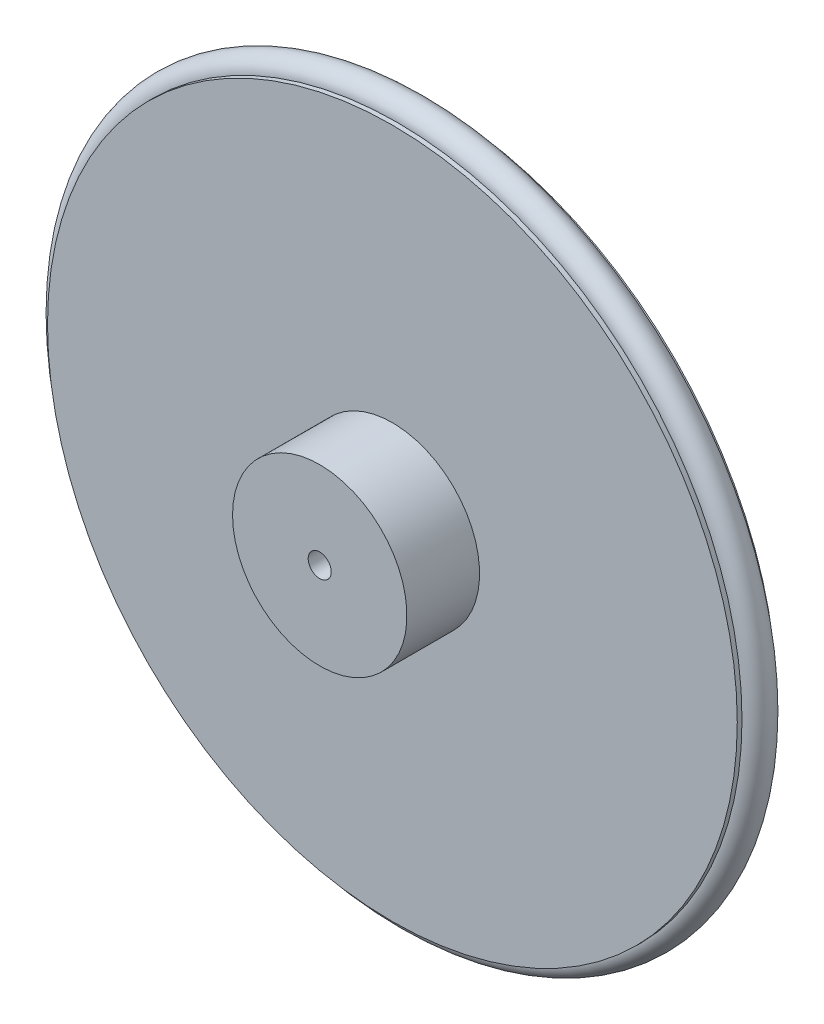
ISO-10303-21;
HEADER;
FILE_DESCRIPTION(('STEP AP214'),'2;1');
FILE_NAME('part.step','',(''),(''),'','','');
FILE_SCHEMA(('AUTOMOTIVE_DESIGN { 1 0 10303 214 1 1 1 1 }'));
ENDSEC;
DATA;
#1=APPLICATION_CONTEXT('core data for automotive mechanical design processes');
#2=APPLICATION_PROTOCOL_DEFINITION('international standard','automotive_design',2000,#1);
#3=PRODUCT_CONTEXT('',#1,'mechanical');
#4=PRODUCT('Part','Part','',(#3));
#5=PRODUCT_RELATED_PRODUCT_CATEGORY('part','',(#4));
#6=PRODUCT_DEFINITION_FORMATION('','',#4);
#7=PRODUCT_DEFINITION_CONTEXT('part definition',#1,'design');
#8=PRODUCT_DEFINITION('design','',#6,#7);
#9=PRODUCT_DEFINITION_SHAPE('','',#8);
#10=(LENGTH_UNIT() NAMED_UNIT(*) SI_UNIT(.MILLI.,.METRE.));
#11=(NAMED_UNIT(*) PLANE_ANGLE_UNIT() SI_UNIT($,.RADIAN.));
#12=(NAMED_UNIT(*) SI_UNIT($,.STERADIAN.) SOLID_ANGLE_UNIT());
#13=UNCERTAINTY_MEASURE_WITH_UNIT(LENGTH_MEASURE(1.E-05),#10,'distance_accuracy_value','');
#14=(GEOMETRIC_REPRESENTATION_CONTEXT(3) GLOBAL_UNCERTAINTY_ASSIGNED_CONTEXT((#13)) GLOBAL_UNIT_ASSIGNED_CONTEXT((#10,
#11,#12)) REPRESENTATION_CONTEXT('',''));
#15=CARTESIAN_POINT('',(0.,0.,0.));
#16=DIRECTION('',(0.,0.,1.));
#17=DIRECTION('',(1.,0.,0.));
#18=AXIS2_PLACEMENT_3D('',#15,#16,#17);
#19=CARTESIAN_POINT('',(7.55868520061591,0.,-14.3137465219913));
#20=DIRECTION('',(0.,0.,-1.));
#21=DIRECTION('',(-1.,0.,0.));
#22=AXIS2_PLACEMENT_3D('',#19,#20,#21);
#23=PLANE('',#22);
#24=CARTESIAN_POINT('',(0.,0.,-14.3137465219913));
#25=DIRECTION('',(0.,0.,-1.));
#26=DIRECTION('',(-1.,0.,0.));
#27=AXIS2_PLACEMENT_3D('',#24,#25,#26);
#28=CIRCLE('',#27,29.9);
#29=CARTESIAN_POINT('',(-29.9,0.,-14.3137465219913));
#30=VERTEX_POINT('',#29);
#31=EDGE_CURVE('E10',#30,#30,#28,.T.);
#32=ORIENTED_EDGE('',*,*,#31,.F.);
#33=EDGE_LOOP('',(#32));
#34=FACE_BOUND('',#33,.T.);
#35=CARTESIAN_POINT('',(0.,0.,-14.3137465219913));
#36=DIRECTION('',(0.,0.,-1.));
#37=DIRECTION('',(-1.,0.,0.));
#38=AXIS2_PLACEMENT_3D('',#35,#36,#37);
#39=CIRCLE('',#38,7.55868520061591);
#40=CARTESIAN_POINT('',(-7.55868520061591,0.,-14.3137465219913));
#41=VERTEX_POINT('',#40);
#42=EDGE_CURVE('E62',#41,#41,#39,.T.);
#43=ORIENTED_EDGE('',*,*,#42,.T.);
#44=EDGE_LOOP('',(#43));
#45=FACE_BOUND('',#44,.T.);
#46=ADVANCED_FACE('F34',(#34,#45),#23,.F.);
#47=CARTESIAN_POINT('',(0.,0.,-20.0286107365983));
#48=DIRECTION('',(0.,0.,-1.));
#49=DIRECTION('',(-1.,0.,0.));
#50=AXIS2_PLACEMENT_3D('',#47,#48,#49);
#51=CYLINDRICAL_SURFACE('',#50,29.9);
#52=CARTESIAN_POINT('',(0.,0.,-14.7237465219913));
#53=DIRECTION('',(0.,0.,-1.));
#54=DIRECTION('',(-1.,0.,0.));
#55=AXIS2_PLACEMENT_3D('',#52,#53,#54);
#56=CIRCLE('',#55,29.9);
#57=CARTESIAN_POINT('',(-29.9,0.,-14.7237465219913));
#58=VERTEX_POINT('',#57);
#59=EDGE_CURVE('E40',#58,#58,#56,.T.);
#60=ORIENTED_EDGE('',*,*,#59,.F.);
#61=EDGE_LOOP('',(#60));
#62=FACE_BOUND('',#61,.T.);
#63=ORIENTED_EDGE('',*,*,#31,.T.);
#64=EDGE_LOOP('',(#63));
#65=FACE_BOUND('',#64,.T.);
#66=ADVANCED_FACE('F96',(#62,#65),#51,.T.);
#67=CARTESIAN_POINT('',(0.,0.,-16.0137465219913));
#68=DIRECTION('',(0.,0.,-1.));
#69=DIRECTION('',(-1.,0.,0.));
#70=AXIS2_PLACEMENT_3D('',#67,#68,#69);
#71=TOROIDAL_SURFACE('',#70,29.9,1.29);
#72=CARTESIAN_POINT('',(0.,0.,-17.3037465219913));
#73=DIRECTION('',(0.,0.,-1.));
#74=DIRECTION('',(-1.,0.,0.));
#75=AXIS2_PLACEMENT_3D('',#72,#73,#74);
#76=CIRCLE('',#75,29.9);
#77=CARTESIAN_POINT('',(-29.9,0.,-17.3037465219913));
#78=VERTEX_POINT('',#77);
#79=EDGE_CURVE('E44',#78,#78,#76,.T.);
#80=ORIENTED_EDGE('',*,*,#79,.F.);
#81=EDGE_LOOP('',(#80));
#82=FACE_BOUND('',#81,.T.);
#83=ORIENTED_EDGE('',*,*,#59,.T.);
#84=EDGE_LOOP('',(#83));
#85=FACE_BOUND('',#84,.T.);
#86=ADVANCED_FACE('F101',(#82,#85),#71,.T.);
#87=CARTESIAN_POINT('',(0.,0.,-20.0286107365983));
#88=DIRECTION('',(0.,0.,-1.));
#89=DIRECTION('',(-1.,0.,0.));
#90=AXIS2_PLACEMENT_3D('',#87,#88,#89);
#91=CYLINDRICAL_SURFACE('',#90,29.9);
#92=CARTESIAN_POINT('',(0.,0.,-17.7137465219913));
#93=DIRECTION('',(0.,0.,-1.));
#94=DIRECTION('',(-1.,0.,0.));
#95=AXIS2_PLACEMENT_3D('',#92,#93,#94);
#96=CIRCLE('',#95,29.9);
#97=CARTESIAN_POINT('',(-29.9,0.,-17.7137465219913));
#98=VERTEX_POINT('',#97);
#99=EDGE_CURVE('E48',#98,#98,#96,.T.);
#100=ORIENTED_EDGE('',*,*,#99,.F.);
#101=EDGE_LOOP('',(#100));
#102=FACE_BOUND('',#101,.T.);
#103=ORIENTED_EDGE('',*,*,#79,.T.);
#104=EDGE_LOOP('',(#103));
#105=FACE_BOUND('',#104,.T.);
#106=ADVANCED_FACE('F92',(#102,#105),#91,.T.);
#107=CARTESIAN_POINT('',(0.,0.,-17.7137465219913));
#108=DIRECTION('',(0.,0.,1.));
#109=DIRECTION('',(1.,0.,0.));
#110=AXIS2_PLACEMENT_3D('',#107,#108,#109);
#111=PLANE('',#110);
#112=ORIENTED_EDGE('',*,*,#99,.T.);
#113=EDGE_LOOP('',(#112));
#114=FACE_BOUND('',#113,.T.);
#115=ADVANCED_FACE('F87',(#114),#111,.F.);
#116=CARTESIAN_POINT('',(0.,0.,-17.0528960281312));
#117=DIRECTION('',(0.,0.,-1.));
#118=DIRECTION('',(-1.,0.,0.));
#119=AXIS2_PLACEMENT_3D('',#116,#117,#118);
#120=PLANE('',#119);
#121=CARTESIAN_POINT('',(0.,0.,-17.0528960281312));
#122=DIRECTION('',(0.,0.,-1.));
#123=DIRECTION('',(-1.,0.,0.));
#124=AXIS2_PLACEMENT_3D('',#121,#122,#123);
#125=CIRCLE('',#124,1.);
#126=CARTESIAN_POINT('',(-1.,0.,-17.0528960281312));
#127=VERTEX_POINT('',#126);
#128=EDGE_CURVE('E53',#127,#127,#125,.T.);
#129=ORIENTED_EDGE('',*,*,#128,.F.);
#130=EDGE_LOOP('',(#129));
#131=FACE_BOUND('',#130,.T.);
#132=ADVANCED_FACE('F82',(#131),#120,.F.);
#133=CARTESIAN_POINT('',(0.,0.,-20.0286107365983));
#134=DIRECTION('',(0.,0.,-1.));
#135=DIRECTION('',(-1.,0.,0.));
#136=AXIS2_PLACEMENT_3D('',#133,#134,#135);
#137=CYLINDRICAL_SURFACE('',#136,1.);
#138=CARTESIAN_POINT('',(0.,0.,-8.01374652199125));
#139=DIRECTION('',(0.,0.,-1.));
#140=DIRECTION('',(-1.,0.,0.));
#141=AXIS2_PLACEMENT_3D('',#138,#139,#140);
#142=CIRCLE('',#141,1.);
#143=CARTESIAN_POINT('',(-1.,0.,-8.01374652199125));
#144=VERTEX_POINT('',#143);
#145=EDGE_CURVE('E56',#144,#144,#142,.T.);
#146=ORIENTED_EDGE('',*,*,#145,.F.);
#147=EDGE_LOOP('',(#146));
#148=FACE_BOUND('',#147,.T.);
#149=ORIENTED_EDGE('',*,*,#128,.T.);
#150=EDGE_LOOP('',(#149));
#151=FACE_BOUND('',#150,.T.);
#152=ADVANCED_FACE('F76',(#148,#151),#137,.F.);
#153=CARTESIAN_POINT('',(1.,0.,-8.01374652199125));
#154=DIRECTION('',(0.,0.,-1.));
#155=DIRECTION('',(-1.,0.,0.));
#156=AXIS2_PLACEMENT_3D('',#153,#154,#155);
#157=PLANE('',#156);
#158=CARTESIAN_POINT('',(0.,0.,-8.01374652199125));
#159=DIRECTION('',(0.,0.,-1.));
#160=DIRECTION('',(-1.,0.,0.));
#161=AXIS2_PLACEMENT_3D('',#158,#159,#160);
#162=CIRCLE('',#161,7.55868520061591);
#163=CARTESIAN_POINT('',(-7.55868520061591,0.,-8.01374652199125));
#164=VERTEX_POINT('',#163);
#165=EDGE_CURVE('E59',#164,#164,#162,.T.);
#166=ORIENTED_EDGE('',*,*,#165,.F.);
#167=EDGE_LOOP('',(#166));
#168=FACE_BOUND('',#167,.T.);
#169=ORIENTED_EDGE('',*,*,#145,.T.);
#170=EDGE_LOOP('',(#169));
#171=FACE_BOUND('',#170,.T.);
#172=ADVANCED_FACE('F70',(#168,#171),#157,.F.);
#173=CARTESIAN_POINT('',(0.,0.,-20.0286107365983));
#174=DIRECTION('',(0.,0.,-1.));
#175=DIRECTION('',(-1.,0.,0.));
#176=AXIS2_PLACEMENT_3D('',#173,#174,#175);
#177=CYLINDRICAL_SURFACE('',#176,7.55868520061591);
#178=ORIENTED_EDGE('',*,*,#42,.F.);
#179=EDGE_LOOP('',(#178));
#180=FACE_BOUND('',#179,.T.);
#181=ORIENTED_EDGE('',*,*,#165,.T.);
#182=EDGE_LOOP('',(#181));
#183=FACE_BOUND('',#182,.T.);
#184=ADVANCED_FACE('F67',(#180,#183),#177,.T.);
#185=CLOSED_SHELL('',(#46,#66,#86,#106,#115,#132,#152,#172,#184));
#186=MANIFOLD_SOLID_BREP('B2',#185);
#187=ADVANCED_BREP_SHAPE_REPRESENTATION('',(#18,#186),#14);
#188=SHAPE_DEFINITION_REPRESENTATION(#9,#187);
ENDSEC;
END-ISO-10303-21;
